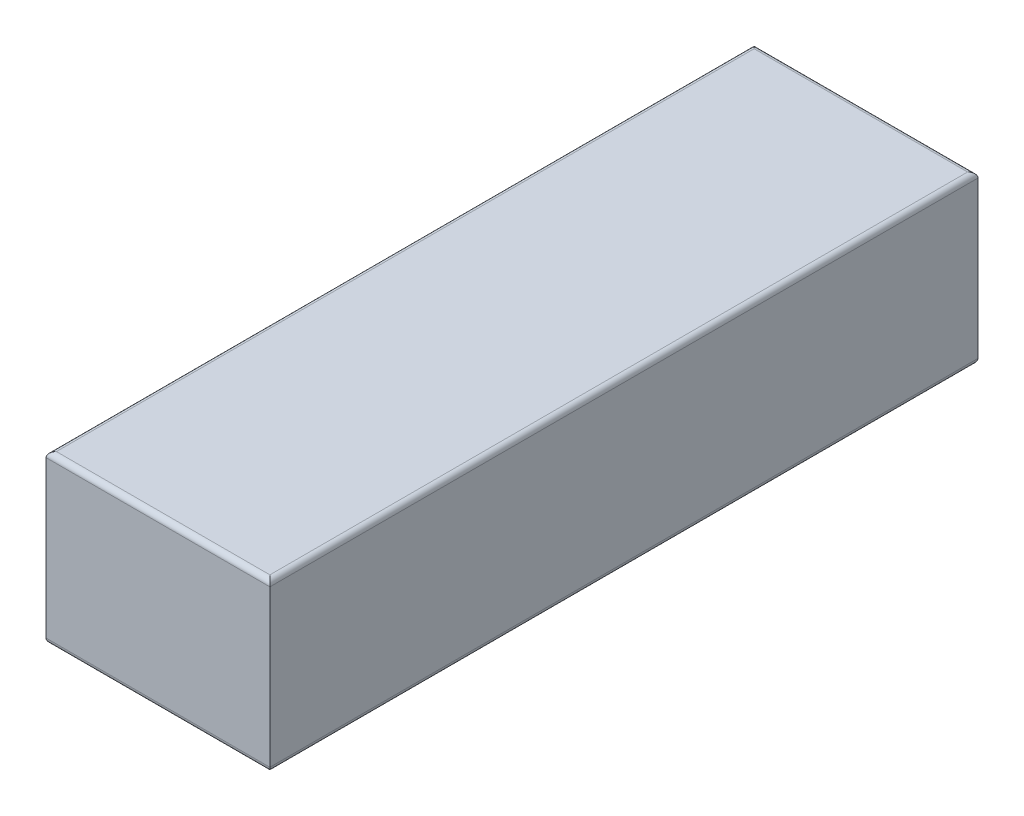
ISO-10303-21;
HEADER;
FILE_DESCRIPTION(('STEP AP214'),'2;1');
FILE_NAME('part.step','',(''),(''),'','','');
FILE_SCHEMA(('AUTOMOTIVE_DESIGN { 1 0 10303 214 1 1 1 1 }'));
ENDSEC;
DATA;
#1=APPLICATION_CONTEXT('core data for automotive mechanical design processes');
#2=APPLICATION_PROTOCOL_DEFINITION('international standard','automotive_design',2000,#1);
#3=PRODUCT_CONTEXT('',#1,'mechanical');
#4=PRODUCT('Part','Part','',(#3));
#5=PRODUCT_RELATED_PRODUCT_CATEGORY('part','',(#4));
#6=PRODUCT_DEFINITION_FORMATION('','',#4);
#7=PRODUCT_DEFINITION_CONTEXT('part definition',#1,'design');
#8=PRODUCT_DEFINITION('design','',#6,#7);
#9=PRODUCT_DEFINITION_SHAPE('','',#8);
#10=(LENGTH_UNIT() NAMED_UNIT(*) SI_UNIT(.MILLI.,.METRE.));
#11=(NAMED_UNIT(*) PLANE_ANGLE_UNIT() SI_UNIT($,.RADIAN.));
#12=(NAMED_UNIT(*) SI_UNIT($,.STERADIAN.) SOLID_ANGLE_UNIT());
#13=UNCERTAINTY_MEASURE_WITH_UNIT(LENGTH_MEASURE(1.E-05),#10,'distance_accuracy_value','');
#14=(GEOMETRIC_REPRESENTATION_CONTEXT(3) GLOBAL_UNCERTAINTY_ASSIGNED_CONTEXT((#13)) GLOBAL_UNIT_ASSIGNED_CONTEXT((#10,
#11,#12)) REPRESENTATION_CONTEXT('',''));
#15=CARTESIAN_POINT('',(0.,0.,0.));
#16=DIRECTION('',(0.,0.,1.));
#17=DIRECTION('',(1.,0.,0.));
#18=AXIS2_PLACEMENT_3D('',#15,#16,#17);
#19=CARTESIAN_POINT('',(21.5,32.,68.));
#20=DIRECTION('',(-1.,0.,0.));
#21=DIRECTION('',(0.,0.,1.));
#22=AXIS2_PLACEMENT_3D('',#19,#20,#21);
#23=PLANE('',#22);
#24=DIRECTION('',(0.,-1.,0.));
#25=VECTOR('',#24,1.);
#26=CARTESIAN_POINT('',(21.5,32.,68.));
#27=LINE('',#26,#25);
#28=CARTESIAN_POINT('',(21.5,31.,68.));
#29=VERTEX_POINT('',#28);
#30=CARTESIAN_POINT('',(21.5,1.,68.));
#31=VERTEX_POINT('',#30);
#32=EDGE_CURVE('E162',#29,#31,#27,.T.);
#33=ORIENTED_EDGE('',*,*,#32,.T.);
#34=DIRECTION('',(0.,0.,-1.));
#35=VECTOR('',#34,1.);
#36=CARTESIAN_POINT('',(21.5,1.,-68.));
#37=LINE('',#36,#35);
#38=CARTESIAN_POINT('',(21.5,1.,-68.));
#39=VERTEX_POINT('',#38);
#40=EDGE_CURVE('E176',#31,#39,#37,.T.);
#41=ORIENTED_EDGE('',*,*,#40,.T.);
#42=DIRECTION('',(0.,-1.,0.));
#43=VECTOR('',#42,1.);
#44=CARTESIAN_POINT('',(21.5,32.,-68.));
#45=LINE('',#44,#43);
#46=CARTESIAN_POINT('',(21.5,31.,-68.));
#47=VERTEX_POINT('',#46);
#48=EDGE_CURVE('E133',#47,#39,#45,.T.);
#49=ORIENTED_EDGE('',*,*,#48,.F.);
#50=DIRECTION('',(0.,0.,-1.));
#51=VECTOR('',#50,1.);
#52=CARTESIAN_POINT('',(21.5,31.,68.));
#53=LINE('',#52,#51);
#54=EDGE_CURVE('E179',#47,#29,#53,.F.);
#55=ORIENTED_EDGE('',*,*,#54,.T.);
#56=EDGE_LOOP('',(#33,#41,#49,#55));
#57=FACE_BOUND('',#56,.T.);
#58=ADVANCED_FACE('F43',(#57),#23,.F.);
#59=CARTESIAN_POINT('',(-21.5,32.,-68.));
#60=DIRECTION('',(0.,0.,1.));
#61=DIRECTION('',(1.,0.,0.));
#62=AXIS2_PLACEMENT_3D('',#59,#60,#61);
#63=PLANE('',#62);
#64=ORIENTED_EDGE('',*,*,#48,.T.);
#65=DIRECTION('',(-1.,0.,0.));
#66=VECTOR('',#65,1.);
#67=CARTESIAN_POINT('',(-21.5,1.,-68.));
#68=LINE('',#67,#66);
#69=CARTESIAN_POINT('',(-21.5,1.,-68.));
#70=VERTEX_POINT('',#69);
#71=EDGE_CURVE('E131',#39,#70,#68,.T.);
#72=ORIENTED_EDGE('',*,*,#71,.T.);
#73=DIRECTION('',(0.,-1.,0.));
#74=VECTOR('',#73,1.);
#75=CARTESIAN_POINT('',(-21.5,32.,-68.));
#76=LINE('',#75,#74);
#77=CARTESIAN_POINT('',(-21.5,31.,-68.));
#78=VERTEX_POINT('',#77);
#79=EDGE_CURVE('E113',#78,#70,#76,.T.);
#80=ORIENTED_EDGE('',*,*,#79,.F.);
#81=DIRECTION('',(-1.,0.,0.));
#82=VECTOR('',#81,1.);
#83=CARTESIAN_POINT('',(-21.5,31.,-68.));
#84=LINE('',#83,#82);
#85=EDGE_CURVE('E128',#78,#47,#84,.F.);
#86=ORIENTED_EDGE('',*,*,#85,.T.);
#87=EDGE_LOOP('',(#64,#72,#80,#86));
#88=FACE_BOUND('',#87,.T.);
#89=ADVANCED_FACE('F127',(#88),#63,.F.);
#90=CARTESIAN_POINT('',(-21.5,32.,68.));
#91=DIRECTION('',(1.,0.,0.));
#92=DIRECTION('',(0.,0.,-1.));
#93=AXIS2_PLACEMENT_3D('',#90,#91,#92);
#94=PLANE('',#93);
#95=ORIENTED_EDGE('',*,*,#79,.T.);
#96=DIRECTION('',(0.,0.,1.));
#97=VECTOR('',#96,1.);
#98=CARTESIAN_POINT('',(-21.5,1.,68.));
#99=LINE('',#98,#97);
#100=CARTESIAN_POINT('',(-21.5,1.,68.));
#101=VERTEX_POINT('',#100);
#102=EDGE_CURVE('E120',#70,#101,#99,.T.);
#103=ORIENTED_EDGE('',*,*,#102,.T.);
#104=DIRECTION('',(0.,-1.,0.));
#105=VECTOR('',#104,1.);
#106=CARTESIAN_POINT('',(-21.5,32.,68.));
#107=LINE('',#106,#105);
#108=CARTESIAN_POINT('',(-21.5,31.,68.));
#109=VERTEX_POINT('',#108);
#110=EDGE_CURVE('E115',#109,#101,#107,.T.);
#111=ORIENTED_EDGE('',*,*,#110,.F.);
#112=DIRECTION('',(0.,0.,1.));
#113=VECTOR('',#112,1.);
#114=CARTESIAN_POINT('',(-21.5,31.,68.));
#115=LINE('',#114,#113);
#116=EDGE_CURVE('E110',#109,#78,#115,.F.);
#117=ORIENTED_EDGE('',*,*,#116,.T.);
#118=EDGE_LOOP('',(#95,#103,#111,#117));
#119=FACE_BOUND('',#118,.T.);
#120=ADVANCED_FACE('F112',(#119),#94,.F.);
#121=CARTESIAN_POINT('',(-21.5,32.,68.));
#122=DIRECTION('',(0.,0.,-1.));
#123=DIRECTION('',(-1.,0.,0.));
#124=AXIS2_PLACEMENT_3D('',#121,#122,#123);
#125=PLANE('',#124);
#126=ORIENTED_EDGE('',*,*,#110,.T.);
#127=DIRECTION('',(1.,0.,0.));
#128=VECTOR('',#127,1.);
#129=CARTESIAN_POINT('',(21.5,1.,68.));
#130=LINE('',#129,#128);
#131=EDGE_CURVE('E182',#101,#31,#130,.T.);
#132=ORIENTED_EDGE('',*,*,#131,.T.);
#133=ORIENTED_EDGE('',*,*,#32,.F.);
#134=DIRECTION('',(1.,0.,0.));
#135=VECTOR('',#134,1.);
#136=CARTESIAN_POINT('',(-21.5,31.,68.));
#137=LINE('',#136,#135);
#138=EDGE_CURVE('E185',#29,#109,#137,.F.);
#139=ORIENTED_EDGE('',*,*,#138,.T.);
#140=EDGE_LOOP('',(#126,#132,#133,#139));
#141=FACE_BOUND('',#140,.T.);
#142=ADVANCED_FACE('F233',(#141),#125,.F.);
#143=CARTESIAN_POINT('',(0.,32.,0.));
#144=DIRECTION('',(0.,-1.,0.));
#145=DIRECTION('',(0.,0.,-1.));
#146=AXIS2_PLACEMENT_3D('',#143,#144,#145);
#147=PLANE('',#146);
#148=DIRECTION('',(0.,0.,1.));
#149=VECTOR('',#148,1.);
#150=CARTESIAN_POINT('',(-20.5,32.,0.));
#151=LINE('',#150,#149);
#152=CARTESIAN_POINT('',(-20.5,32.,-67.));
#153=VERTEX_POINT('',#152);
#154=CARTESIAN_POINT('',(-20.5,32.,67.));
#155=VERTEX_POINT('',#154);
#156=EDGE_CURVE('E53',#153,#155,#151,.T.);
#157=ORIENTED_EDGE('',*,*,#156,.T.);
#158=DIRECTION('',(1.,0.,0.));
#159=VECTOR('',#158,1.);
#160=CARTESIAN_POINT('',(0.,32.,67.));
#161=LINE('',#160,#159);
#162=CARTESIAN_POINT('',(20.5,32.,67.));
#163=VERTEX_POINT('',#162);
#164=EDGE_CURVE('E11',#155,#163,#161,.T.);
#165=ORIENTED_EDGE('',*,*,#164,.T.);
#166=DIRECTION('',(0.,0.,-1.));
#167=VECTOR('',#166,1.);
#168=CARTESIAN_POINT('',(20.5,32.,0.));
#169=LINE('',#168,#167);
#170=CARTESIAN_POINT('',(20.5,32.,-67.));
#171=VERTEX_POINT('',#170);
#172=EDGE_CURVE('E173',#163,#171,#169,.T.);
#173=ORIENTED_EDGE('',*,*,#172,.T.);
#174=DIRECTION('',(-1.,0.,0.));
#175=VECTOR('',#174,1.);
#176=CARTESIAN_POINT('',(0.,32.,-67.));
#177=LINE('',#176,#175);
#178=EDGE_CURVE('E64',#171,#153,#177,.T.);
#179=ORIENTED_EDGE('',*,*,#178,.T.);
#180=EDGE_LOOP('',(#157,#165,#173,#179));
#181=FACE_BOUND('',#180,.T.);
#182=ADVANCED_FACE('F239',(#181),#147,.F.);
#183=CARTESIAN_POINT('',(0.,0.,0.));
#184=DIRECTION('',(0.,-1.,0.));
#185=DIRECTION('',(0.,0.,-1.));
#186=AXIS2_PLACEMENT_3D('',#183,#184,#185);
#187=PLANE('',#186);
#188=DIRECTION('',(0.,0.,1.));
#189=VECTOR('',#188,1.);
#190=CARTESIAN_POINT('',(-20.5,0.,-68.));
#191=LINE('',#190,#189);
#192=CARTESIAN_POINT('',(-20.5,0.,67.));
#193=VERTEX_POINT('',#192);
#194=CARTESIAN_POINT('',(-20.5,0.,-67.));
#195=VERTEX_POINT('',#194);
#196=EDGE_CURVE('E193',#193,#195,#191,.F.);
#197=ORIENTED_EDGE('',*,*,#196,.T.);
#198=DIRECTION('',(-1.,0.,0.));
#199=VECTOR('',#198,1.);
#200=CARTESIAN_POINT('',(21.5,0.,-67.));
#201=LINE('',#200,#199);
#202=CARTESIAN_POINT('',(20.5,0.,-67.));
#203=VERTEX_POINT('',#202);
#204=EDGE_CURVE('E121',#195,#203,#201,.F.);
#205=ORIENTED_EDGE('',*,*,#204,.T.);
#206=DIRECTION('',(0.,0.,-1.));
#207=VECTOR('',#206,1.);
#208=CARTESIAN_POINT('',(20.5,0.,68.));
#209=LINE('',#208,#207);
#210=CARTESIAN_POINT('',(20.5,0.,67.));
#211=VERTEX_POINT('',#210);
#212=EDGE_CURVE('E199',#203,#211,#209,.F.);
#213=ORIENTED_EDGE('',*,*,#212,.T.);
#214=DIRECTION('',(1.,0.,0.));
#215=VECTOR('',#214,1.);
#216=CARTESIAN_POINT('',(-21.5,0.,67.));
#217=LINE('',#216,#215);
#218=EDGE_CURVE('E196',#211,#193,#217,.F.);
#219=ORIENTED_EDGE('',*,*,#218,.T.);
#220=EDGE_LOOP('',(#197,#205,#213,#219));
#221=FACE_BOUND('',#220,.T.);
#222=ADVANCED_FACE('F241',(#221),#187,.T.);
#223=CARTESIAN_POINT('',(-21.5,1.,67.));
#224=DIRECTION('',(-1.,0.,0.));
#225=DIRECTION('',(0.,0.,1.));
#226=AXIS2_PLACEMENT_3D('',#223,#224,#225);
#227=CYLINDRICAL_SURFACE('',#226,1.);
#228=CARTESIAN_POINT('',(-20.5,1.,67.));
#229=DIRECTION('',(-0.707106781186547,0.,-0.707106781186547));
#230=DIRECTION('',(-0.707106781186547,0.,0.707106781186547));
#231=AXIS2_PLACEMENT_3D('',#228,#229,#230);
#232=ELLIPSE('',#231,1.41421356237309,1.);
#233=EDGE_CURVE('E163',#193,#101,#232,.T.);
#234=ORIENTED_EDGE('',*,*,#233,.F.);
#235=ORIENTED_EDGE('',*,*,#218,.F.);
#236=CARTESIAN_POINT('',(20.5,1.,67.));
#237=DIRECTION('',(-0.707106781186547,0.,0.707106781186547));
#238=DIRECTION('',(0.707106781186547,0.,0.707106781186547));
#239=AXIS2_PLACEMENT_3D('',#236,#237,#238);
#240=ELLIPSE('',#239,1.41421356237309,1.);
#241=EDGE_CURVE('E158',#31,#211,#240,.F.);
#242=ORIENTED_EDGE('',*,*,#241,.F.);
#243=ORIENTED_EDGE('',*,*,#131,.F.);
#244=EDGE_LOOP('',(#234,#235,#242,#243));
#245=FACE_BOUND('',#244,.T.);
#246=ADVANCED_FACE('F220',(#245),#227,.T.);
#247=CARTESIAN_POINT('',(20.5,1.,68.));
#248=DIRECTION('',(0.,0.,1.));
#249=DIRECTION('',(1.,0.,0.));
#250=AXIS2_PLACEMENT_3D('',#247,#248,#249);
#251=CYLINDRICAL_SURFACE('',#250,1.);
#252=ORIENTED_EDGE('',*,*,#241,.T.);
#253=ORIENTED_EDGE('',*,*,#212,.F.);
#254=CARTESIAN_POINT('',(20.5,1.,-67.));
#255=DIRECTION('',(0.707106781186547,0.,0.707106781186547));
#256=DIRECTION('',(-0.707106781186547,0.,0.707106781186547));
#257=AXIS2_PLACEMENT_3D('',#254,#255,#256);
#258=ELLIPSE('',#257,1.41421356237309,1.);
#259=EDGE_CURVE('E147',#39,#203,#258,.F.);
#260=ORIENTED_EDGE('',*,*,#259,.F.);
#261=ORIENTED_EDGE('',*,*,#40,.F.);
#262=EDGE_LOOP('',(#252,#253,#260,#261));
#263=FACE_BOUND('',#262,.T.);
#264=ADVANCED_FACE('F224',(#263),#251,.T.);
#265=CARTESIAN_POINT('',(-20.5,1.,68.));
#266=DIRECTION('',(0.,0.,-1.));
#267=DIRECTION('',(-1.,0.,0.));
#268=AXIS2_PLACEMENT_3D('',#265,#266,#267);
#269=CYLINDRICAL_SURFACE('',#268,1.);
#270=ORIENTED_EDGE('',*,*,#233,.T.);
#271=ORIENTED_EDGE('',*,*,#102,.F.);
#272=CARTESIAN_POINT('',(-20.5,1.,-67.));
#273=DIRECTION('',(0.707106781186547,0.,-0.707106781186547));
#274=DIRECTION('',(-0.707106781186547,0.,-0.707106781186547));
#275=AXIS2_PLACEMENT_3D('',#272,#273,#274);
#276=ELLIPSE('',#275,1.41421356237309,1.);
#277=EDGE_CURVE('E144',#195,#70,#276,.T.);
#278=ORIENTED_EDGE('',*,*,#277,.F.);
#279=ORIENTED_EDGE('',*,*,#196,.F.);
#280=EDGE_LOOP('',(#270,#271,#278,#279));
#281=FACE_BOUND('',#280,.T.);
#282=ADVANCED_FACE('F232',(#281),#269,.T.);
#283=CARTESIAN_POINT('',(-21.5,1.,-67.));
#284=DIRECTION('',(1.,0.,0.));
#285=DIRECTION('',(0.,0.,-1.));
#286=AXIS2_PLACEMENT_3D('',#283,#284,#285);
#287=CYLINDRICAL_SURFACE('',#286,1.);
#288=ORIENTED_EDGE('',*,*,#259,.T.);
#289=ORIENTED_EDGE('',*,*,#204,.F.);
#290=ORIENTED_EDGE('',*,*,#277,.T.);
#291=ORIENTED_EDGE('',*,*,#71,.F.);
#292=EDGE_LOOP('',(#288,#289,#290,#291));
#293=FACE_BOUND('',#292,.T.);
#294=ADVANCED_FACE('F227',(#293),#287,.T.);
#295=CARTESIAN_POINT('',(0.,31.,-67.));
#296=DIRECTION('',(-1.,0.,0.));
#297=DIRECTION('',(0.,0.,1.));
#298=AXIS2_PLACEMENT_3D('',#295,#296,#297);
#299=CYLINDRICAL_SURFACE('',#298,1.);
#300=CARTESIAN_POINT('',(20.5,31.,-67.));
#301=DIRECTION('',(-0.707106781186547,0.,-0.707106781186547));
#302=DIRECTION('',(0.707106781186547,0.,-0.707106781186547));
#303=AXIS2_PLACEMENT_3D('',#300,#301,#302);
#304=ELLIPSE('',#303,1.41421356237309,1.);
#305=EDGE_CURVE('E138',#47,#171,#304,.F.);
#306=ORIENTED_EDGE('',*,*,#305,.F.);
#307=ORIENTED_EDGE('',*,*,#85,.F.);
#308=CARTESIAN_POINT('',(-20.5,31.,-67.));
#309=DIRECTION('',(-0.707106781186547,0.,0.707106781186547));
#310=DIRECTION('',(-0.707106781186547,0.,-0.707106781186547));
#311=AXIS2_PLACEMENT_3D('',#308,#309,#310);
#312=ELLIPSE('',#311,1.41421356237309,1.);
#313=EDGE_CURVE('E47',#153,#78,#312,.T.);
#314=ORIENTED_EDGE('',*,*,#313,.F.);
#315=ORIENTED_EDGE('',*,*,#178,.F.);
#316=EDGE_LOOP('',(#306,#307,#314,#315));
#317=FACE_BOUND('',#316,.T.);
#318=ADVANCED_FACE('F45',(#317),#299,.T.);
#319=CARTESIAN_POINT('',(-20.5,31.,0.));
#320=DIRECTION('',(0.,0.,1.));
#321=DIRECTION('',(1.,0.,0.));
#322=AXIS2_PLACEMENT_3D('',#319,#320,#321);
#323=CYLINDRICAL_SURFACE('',#322,1.);
#324=ORIENTED_EDGE('',*,*,#313,.T.);
#325=ORIENTED_EDGE('',*,*,#116,.F.);
#326=CARTESIAN_POINT('',(-20.5,31.,67.));
#327=DIRECTION('',(0.707106781186547,0.,0.707106781186547));
#328=DIRECTION('',(-0.707106781186547,0.,0.707106781186547));
#329=AXIS2_PLACEMENT_3D('',#326,#327,#328);
#330=ELLIPSE('',#329,1.41421356237309,1.);
#331=EDGE_CURVE('E149',#155,#109,#330,.T.);
#332=ORIENTED_EDGE('',*,*,#331,.F.);
#333=ORIENTED_EDGE('',*,*,#156,.F.);
#334=EDGE_LOOP('',(#324,#325,#332,#333));
#335=FACE_BOUND('',#334,.T.);
#336=ADVANCED_FACE('F142',(#335),#323,.T.);
#337=CARTESIAN_POINT('',(20.5,31.,0.));
#338=DIRECTION('',(0.,0.,-1.));
#339=DIRECTION('',(-1.,0.,0.));
#340=AXIS2_PLACEMENT_3D('',#337,#338,#339);
#341=CYLINDRICAL_SURFACE('',#340,1.);
#342=ORIENTED_EDGE('',*,*,#305,.T.);
#343=ORIENTED_EDGE('',*,*,#172,.F.);
#344=CARTESIAN_POINT('',(20.5,31.,67.));
#345=DIRECTION('',(0.707106781186547,0.,-0.707106781186547));
#346=DIRECTION('',(-0.707106781186547,0.,-0.707106781186547));
#347=AXIS2_PLACEMENT_3D('',#344,#345,#346);
#348=ELLIPSE('',#347,1.41421356237309,1.);
#349=EDGE_CURVE('E153',#29,#163,#348,.F.);
#350=ORIENTED_EDGE('',*,*,#349,.F.);
#351=ORIENTED_EDGE('',*,*,#54,.F.);
#352=EDGE_LOOP('',(#342,#343,#350,#351));
#353=FACE_BOUND('',#352,.T.);
#354=ADVANCED_FACE('F238',(#353),#341,.T.);
#355=CARTESIAN_POINT('',(0.,31.,67.));
#356=DIRECTION('',(1.,0.,0.));
#357=DIRECTION('',(0.,0.,-1.));
#358=AXIS2_PLACEMENT_3D('',#355,#356,#357);
#359=CYLINDRICAL_SURFACE('',#358,1.);
#360=ORIENTED_EDGE('',*,*,#331,.T.);
#361=ORIENTED_EDGE('',*,*,#138,.F.);
#362=ORIENTED_EDGE('',*,*,#349,.T.);
#363=ORIENTED_EDGE('',*,*,#164,.F.);
#364=EDGE_LOOP('',(#360,#361,#362,#363));
#365=FACE_BOUND('',#364,.T.);
#366=ADVANCED_FACE('F236',(#365),#359,.T.);
#367=CLOSED_SHELL('',(#58,#89,#120,#142,#182,#222,#246,#264,#282,#294,#318,#336,#354,#366));
#368=MANIFOLD_SOLID_BREP('B2',#367);
#369=ADVANCED_BREP_SHAPE_REPRESENTATION('',(#18,#368),#14);
#370=SHAPE_DEFINITION_REPRESENTATION(#9,#369);
ENDSEC;
END-ISO-10303-21;
